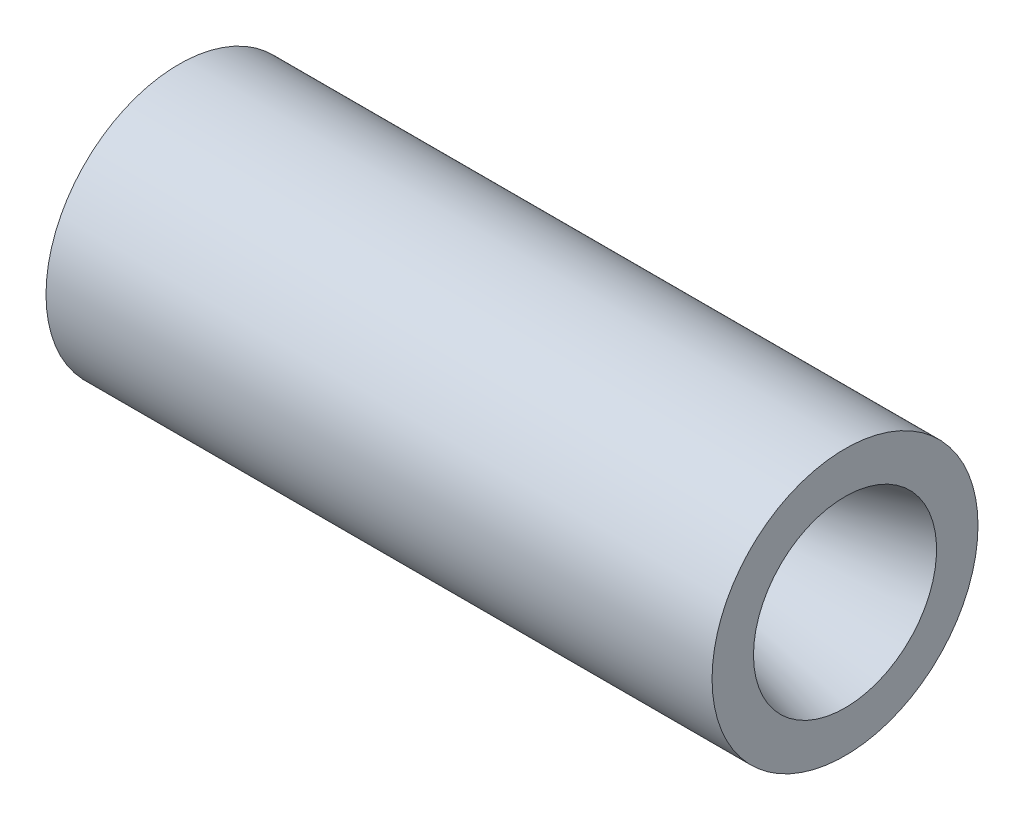
ISO-10303-21;
HEADER;
FILE_DESCRIPTION(('STEP AP214'),'2;1');
FILE_NAME('part.step','',(''),(''),'','','');
FILE_SCHEMA(('AUTOMOTIVE_DESIGN { 1 0 10303 214 1 1 1 1 }'));
ENDSEC;
DATA;
#1=APPLICATION_CONTEXT('core data for automotive mechanical design processes');
#2=APPLICATION_PROTOCOL_DEFINITION('international standard','automotive_design',2000,#1);
#3=PRODUCT_CONTEXT('',#1,'mechanical');
#4=PRODUCT('Part','Part','',(#3));
#5=PRODUCT_RELATED_PRODUCT_CATEGORY('part','',(#4));
#6=PRODUCT_DEFINITION_FORMATION('','',#4);
#7=PRODUCT_DEFINITION_CONTEXT('part definition',#1,'design');
#8=PRODUCT_DEFINITION('design','',#6,#7);
#9=PRODUCT_DEFINITION_SHAPE('','',#8);
#10=(LENGTH_UNIT() NAMED_UNIT(*) SI_UNIT(.MILLI.,.METRE.));
#11=(NAMED_UNIT(*) PLANE_ANGLE_UNIT() SI_UNIT($,.RADIAN.));
#12=(NAMED_UNIT(*) SI_UNIT($,.STERADIAN.) SOLID_ANGLE_UNIT());
#13=UNCERTAINTY_MEASURE_WITH_UNIT(LENGTH_MEASURE(1.E-05),#10,'distance_accuracy_value','');
#14=(GEOMETRIC_REPRESENTATION_CONTEXT(3) GLOBAL_UNCERTAINTY_ASSIGNED_CONTEXT((#13)) GLOBAL_UNIT_ASSIGNED_CONTEXT((#10,
#11,#12)) REPRESENTATION_CONTEXT('',''));
#15=CARTESIAN_POINT('',(0.,0.,0.));
#16=DIRECTION('',(0.,0.,1.));
#17=DIRECTION('',(1.,0.,0.));
#18=AXIS2_PLACEMENT_3D('',#15,#16,#17);
#19=CARTESIAN_POINT('',(0.,53.34,0.));
#20=DIRECTION('',(1.,0.,0.));
#21=DIRECTION('',(0.,0.,-1.));
#22=AXIS2_PLACEMENT_3D('',#19,#20,#21);
#23=PLANE('',#22);
#24=CARTESIAN_POINT('',(0.,0.,0.));
#25=DIRECTION('',(-1.,0.,0.));
#26=DIRECTION('',(0.,0.,1.));
#27=AXIS2_PLACEMENT_3D('',#24,#25,#26);
#28=CIRCLE('',#27,43.2765708);
#29=CARTESIAN_POINT('',(0.,0.,43.2765708));
#30=VERTEX_POINT('',#29);
#31=EDGE_CURVE('E10',#30,#30,#28,.T.);
#32=ORIENTED_EDGE('',*,*,#31,.F.);
#33=EDGE_LOOP('',(#32));
#34=FACE_BOUND('',#33,.T.);
#35=CARTESIAN_POINT('',(0.,0.,0.));
#36=DIRECTION('',(-1.,0.,0.));
#37=DIRECTION('',(0.,0.,1.));
#38=AXIS2_PLACEMENT_3D('',#35,#36,#37);
#39=CIRCLE('',#38,53.34);
#40=CARTESIAN_POINT('',(0.,0.,53.34));
#41=VERTEX_POINT('',#40);
#42=EDGE_CURVE('E65',#41,#41,#39,.T.);
#43=ORIENTED_EDGE('',*,*,#42,.T.);
#44=EDGE_LOOP('',(#43));
#45=FACE_BOUND('',#44,.T.);
#46=ADVANCED_FACE('F37',(#34,#45),#23,.F.);
#47=CARTESIAN_POINT('',(0.,0.,0.));
#48=DIRECTION('',(-1.,0.,0.));
#49=DIRECTION('',(0.,0.,1.));
#50=AXIS2_PLACEMENT_3D('',#47,#48,#49);
#51=CYLINDRICAL_SURFACE('',#50,43.2765708);
#52=CARTESIAN_POINT('',(142.96691498,0.,0.));
#53=DIRECTION('',(-1.,0.,0.));
#54=DIRECTION('',(0.,0.,1.));
#55=AXIS2_PLACEMENT_3D('',#52,#53,#54);
#56=CIRCLE('',#55,43.2765708);
#57=CARTESIAN_POINT('',(142.96691498,0.,43.2765708));
#58=VERTEX_POINT('',#57);
#59=EDGE_CURVE('E43',#58,#58,#56,.T.);
#60=ORIENTED_EDGE('',*,*,#59,.F.);
#61=EDGE_LOOP('',(#60));
#62=FACE_BOUND('',#61,.T.);
#63=ORIENTED_EDGE('',*,*,#31,.T.);
#64=EDGE_LOOP('',(#63));
#65=FACE_BOUND('',#64,.T.);
#66=ADVANCED_FACE('F102',(#62,#65),#51,.F.);
#67=CARTESIAN_POINT('',(142.96691498,0.,0.));
#68=DIRECTION('',(-1.,0.,0.));
#69=DIRECTION('',(0.,0.,1.));
#70=AXIS2_PLACEMENT_3D('',#67,#68,#69);
#71=TOROIDAL_SURFACE('',#70,26.302103352,16.974467448);
#72=CARTESIAN_POINT('',(152.703069527781,0.,0.));
#73=DIRECTION('',(-1.,0.,0.));
#74=DIRECTION('',(0.,0.,1.));
#75=AXIS2_PLACEMENT_3D('',#72,#73,#74);
#76=CIRCLE('',#75,40.2067730627461);
#77=CARTESIAN_POINT('',(152.703069527781,0.,40.2067730627461));
#78=VERTEX_POINT('',#77);
#79=EDGE_CURVE('E47',#78,#78,#76,.T.);
#80=ORIENTED_EDGE('',*,*,#79,.F.);
#81=EDGE_LOOP('',(#80));
#82=FACE_BOUND('',#81,.T.);
#83=ORIENTED_EDGE('',*,*,#59,.T.);
#84=EDGE_LOOP('',(#83));
#85=FACE_BOUND('',#84,.T.);
#86=ADVANCED_FACE('F97',(#82,#85),#71,.F.);
#87=CARTESIAN_POINT('',(152.703069527781,0.,0.));
#88=DIRECTION('',(-1.,0.,0.));
#89=DIRECTION('',(0.,0.,1.));
#90=AXIS2_PLACEMENT_3D('',#87,#88,#89);
#91=CONICAL_SURFACE('',#90,40.2067730627461,0.610865238198016);
#92=CARTESIAN_POINT('',(181.498114963943,0.,0.));
#93=DIRECTION('',(-1.,0.,0.));
#94=DIRECTION('',(0.,0.,1.));
#95=AXIS2_PLACEMENT_3D('',#92,#93,#94);
#96=CIRCLE('',#95,20.0442651852539);
#97=CARTESIAN_POINT('',(181.498114963943,0.,20.0442651852539));
#98=VERTEX_POINT('',#97);
#99=EDGE_CURVE('E51',#98,#98,#96,.T.);
#100=ORIENTED_EDGE('',*,*,#99,.F.);
#101=EDGE_LOOP('',(#100));
#102=FACE_BOUND('',#101,.T.);
#103=ORIENTED_EDGE('',*,*,#79,.T.);
#104=EDGE_LOOP('',(#103));
#105=FACE_BOUND('',#104,.T.);
#106=ADVANCED_FACE('F91',(#102,#105),#91,.F.);
#107=CARTESIAN_POINT('',(191.234269511724,0.,0.));
#108=DIRECTION('',(-1.,0.,0.));
#109=DIRECTION('',(0.,0.,1.));
#110=AXIS2_PLACEMENT_3D('',#107,#108,#109);
#111=TOROIDAL_SURFACE('',#110,33.948934896,16.974467448);
#112=CARTESIAN_POINT('',(195.627584967739,0.,0.));
#113=DIRECTION('',(-1.,0.,0.));
#114=DIRECTION('',(0.,0.,1.));
#115=AXIS2_PLACEMENT_3D('',#112,#113,#114);
#116=CIRCLE('',#115,17.5528584004737);
#117=CARTESIAN_POINT('',(195.627584967739,0.,17.5528584004737));
#118=VERTEX_POINT('',#117);
#119=EDGE_CURVE('E56',#118,#118,#116,.T.);
#120=ORIENTED_EDGE('',*,*,#119,.F.);
#121=EDGE_LOOP('',(#120));
#122=FACE_BOUND('',#121,.T.);
#123=ORIENTED_EDGE('',*,*,#99,.T.);
#124=EDGE_LOOP('',(#123));
#125=FACE_BOUND('',#124,.T.);
#126=ADVANCED_FACE('F85',(#122,#125),#111,.T.);
#127=CARTESIAN_POINT('',(195.627584967739,0.,0.));
#128=DIRECTION('',(1.,0.,0.));
#129=DIRECTION('',(0.,0.,-1.));
#130=AXIS2_PLACEMENT_3D('',#127,#128,#129);
#131=CONICAL_SURFACE('',#130,17.5528584004737,0.261799387799151);
#132=CARTESIAN_POINT('',(267.174285764213,0.,0.));
#133=DIRECTION('',(-1.,0.,0.));
#134=DIRECTION('',(0.,0.,1.));
#135=AXIS2_PLACEMENT_3D('',#132,#133,#134);
#136=CIRCLE('',#135,36.7237391);
#137=CARTESIAN_POINT('',(267.174285764213,0.,36.7237391));
#138=VERTEX_POINT('',#137);
#139=EDGE_CURVE('E59',#138,#138,#136,.T.);
#140=ORIENTED_EDGE('',*,*,#139,.F.);
#141=EDGE_LOOP('',(#140));
#142=FACE_BOUND('',#141,.T.);
#143=ORIENTED_EDGE('',*,*,#119,.T.);
#144=EDGE_LOOP('',(#143));
#145=FACE_BOUND('',#144,.T.);
#146=ADVANCED_FACE('F79',(#142,#145),#131,.F.);
#147=CARTESIAN_POINT('',(267.174285764213,36.7237391,0.));
#148=DIRECTION('',(-1.,0.,0.));
#149=DIRECTION('',(0.,0.,1.));
#150=AXIS2_PLACEMENT_3D('',#147,#148,#149);
#151=PLANE('',#150);
#152=CARTESIAN_POINT('',(267.174285764213,0.,0.));
#153=DIRECTION('',(-1.,0.,0.));
#154=DIRECTION('',(0.,0.,1.));
#155=AXIS2_PLACEMENT_3D('',#152,#153,#154);
#156=CIRCLE('',#155,53.34);
#157=CARTESIAN_POINT('',(267.174285764213,0.,53.34));
#158=VERTEX_POINT('',#157);
#159=EDGE_CURVE('E62',#158,#158,#156,.T.);
#160=ORIENTED_EDGE('',*,*,#159,.F.);
#161=EDGE_LOOP('',(#160));
#162=FACE_BOUND('',#161,.T.);
#163=ORIENTED_EDGE('',*,*,#139,.T.);
#164=EDGE_LOOP('',(#163));
#165=FACE_BOUND('',#164,.T.);
#166=ADVANCED_FACE('F73',(#162,#165),#151,.F.);
#167=CARTESIAN_POINT('',(0.,0.,0.));
#168=DIRECTION('',(-1.,0.,0.));
#169=DIRECTION('',(0.,0.,1.));
#170=AXIS2_PLACEMENT_3D('',#167,#168,#169);
#171=CYLINDRICAL_SURFACE('',#170,53.34);
#172=ORIENTED_EDGE('',*,*,#42,.F.);
#173=EDGE_LOOP('',(#172));
#174=FACE_BOUND('',#173,.T.);
#175=ORIENTED_EDGE('',*,*,#159,.T.);
#176=EDGE_LOOP('',(#175));
#177=FACE_BOUND('',#176,.T.);
#178=ADVANCED_FACE('F70',(#174,#177),#171,.T.);
#179=CLOSED_SHELL('',(#46,#66,#86,#106,#126,#146,#166,#178));
#180=MANIFOLD_SOLID_BREP('B2',#179);
#181=ADVANCED_BREP_SHAPE_REPRESENTATION('',(#18,#180),#14);
#182=SHAPE_DEFINITION_REPRESENTATION(#9,#181);
ENDSEC;
END-ISO-10303-21;
